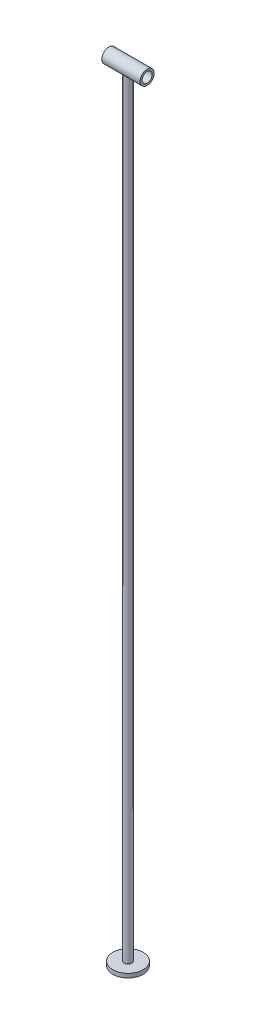
ISO-10303-21;
HEADER;
FILE_DESCRIPTION(('STEP AP214'),'2;1');
FILE_NAME('part.step','',(''),(''),'','','');
FILE_SCHEMA(('AUTOMOTIVE_DESIGN { 1 0 10303 214 1 1 1 1 }'));
ENDSEC;
DATA;
#1=APPLICATION_CONTEXT('core data for automotive mechanical design processes');
#2=APPLICATION_PROTOCOL_DEFINITION('international standard','automotive_design',2000,#1);
#3=PRODUCT_CONTEXT('',#1,'mechanical');
#4=PRODUCT('Part','Part','',(#3));
#5=PRODUCT_RELATED_PRODUCT_CATEGORY('part','',(#4));
#6=PRODUCT_DEFINITION_FORMATION('','',#4);
#7=PRODUCT_DEFINITION_CONTEXT('part definition',#1,'design');
#8=PRODUCT_DEFINITION('design','',#6,#7);
#9=PRODUCT_DEFINITION_SHAPE('','',#8);
#10=(LENGTH_UNIT() NAMED_UNIT(*) SI_UNIT(.MILLI.,.METRE.));
#11=(NAMED_UNIT(*) PLANE_ANGLE_UNIT() SI_UNIT($,.RADIAN.));
#12=(NAMED_UNIT(*) SI_UNIT($,.STERADIAN.) SOLID_ANGLE_UNIT());
#13=UNCERTAINTY_MEASURE_WITH_UNIT(LENGTH_MEASURE(1.E-05),#10,'distance_accuracy_value','');
#14=(GEOMETRIC_REPRESENTATION_CONTEXT(3) GLOBAL_UNCERTAINTY_ASSIGNED_CONTEXT((#13)) GLOBAL_UNIT_ASSIGNED_CONTEXT((#10,
#11,#12)) REPRESENTATION_CONTEXT('',''));
#15=CARTESIAN_POINT('',(0.,0.,0.));
#16=DIRECTION('',(0.,0.,1.));
#17=DIRECTION('',(1.,0.,0.));
#18=AXIS2_PLACEMENT_3D('',#15,#16,#17);
#19=CARTESIAN_POINT('',(-95.,3835.,0.));
#20=DIRECTION('',(1.,0.,0.));
#21=DIRECTION('',(0.,0.,-1.));
#22=AXIS2_PLACEMENT_3D('',#19,#20,#21);
#23=CYLINDRICAL_SURFACE('',#22,34.9999999999998);
#24=CARTESIAN_POINT('',(-95.,3835.,0.));
#25=DIRECTION('',(1.,0.,0.));
#26=DIRECTION('',(0.,0.,-1.));
#27=AXIS2_PLACEMENT_3D('',#24,#25,#26);
#28=CIRCLE('',#27,34.9999999999998);
#29=CARTESIAN_POINT('',(-95.,3835.,-34.9999999999998));
#30=VERTEX_POINT('',#29);
#31=EDGE_CURVE('E11',#30,#30,#28,.T.);
#32=ORIENTED_EDGE('',*,*,#31,.T.);
#33=EDGE_LOOP('',(#32));
#34=FACE_BOUND('',#33,.T.);
#35=CARTESIAN_POINT('',(95.,3835.,0.));
#36=DIRECTION('',(1.,0.,0.));
#37=DIRECTION('',(0.,0.,-1.));
#38=AXIS2_PLACEMENT_3D('',#35,#36,#37);
#39=CIRCLE('',#38,34.9999999999998);
#40=CARTESIAN_POINT('',(95.,3835.,-34.9999999999998));
#41=VERTEX_POINT('',#40);
#42=EDGE_CURVE('E54',#41,#41,#39,.T.);
#43=ORIENTED_EDGE('',*,*,#42,.F.);
#44=EDGE_LOOP('',(#43));
#45=FACE_BOUND('',#44,.T.);
#46=ADVANCED_FACE('F44',(#34,#45),#23,.T.);
#47=CARTESIAN_POINT('',(-95.,3835.,0.));
#48=DIRECTION('',(1.,0.,0.));
#49=DIRECTION('',(0.,0.,-1.));
#50=AXIS2_PLACEMENT_3D('',#47,#48,#49);
#51=PLANE('',#50);
#52=CARTESIAN_POINT('',(-95.,3835.,0.));
#53=DIRECTION('',(1.,0.,0.));
#54=DIRECTION('',(0.,0.,-1.));
#55=AXIS2_PLACEMENT_3D('',#52,#53,#54);
#56=CIRCLE('',#55,25.0000000000003);
#57=CARTESIAN_POINT('',(-95.,3835.,-25.0000000000003));
#58=VERTEX_POINT('',#57);
#59=EDGE_CURVE('E50',#58,#58,#56,.T.);
#60=ORIENTED_EDGE('',*,*,#59,.T.);
#61=EDGE_LOOP('',(#60));
#62=FACE_BOUND('',#61,.T.);
#63=ORIENTED_EDGE('',*,*,#31,.F.);
#64=EDGE_LOOP('',(#63));
#65=FACE_BOUND('',#64,.T.);
#66=ADVANCED_FACE('F73',(#62,#65),#51,.F.);
#67=CARTESIAN_POINT('',(-95.,3835.,0.));
#68=DIRECTION('',(1.,0.,0.));
#69=DIRECTION('',(0.,0.,-1.));
#70=AXIS2_PLACEMENT_3D('',#67,#68,#69);
#71=CYLINDRICAL_SURFACE('',#70,25.0000000000003);
#72=ORIENTED_EDGE('',*,*,#59,.F.);
#73=EDGE_LOOP('',(#72));
#74=FACE_BOUND('',#73,.T.);
#75=CARTESIAN_POINT('',(95.,3835.,0.));
#76=DIRECTION('',(1.,0.,0.));
#77=DIRECTION('',(0.,0.,-1.));
#78=AXIS2_PLACEMENT_3D('',#75,#76,#77);
#79=CIRCLE('',#78,25.0000000000003);
#80=CARTESIAN_POINT('',(95.,3835.,-25.0000000000003));
#81=VERTEX_POINT('',#80);
#82=EDGE_CURVE('E58',#81,#81,#79,.T.);
#83=ORIENTED_EDGE('',*,*,#82,.T.);
#84=EDGE_LOOP('',(#83));
#85=FACE_BOUND('',#84,.T.);
#86=ADVANCED_FACE('F64',(#74,#85),#71,.F.);
#87=CARTESIAN_POINT('',(95.,3835.,0.));
#88=DIRECTION('',(1.,0.,0.));
#89=DIRECTION('',(0.,0.,-1.));
#90=AXIS2_PLACEMENT_3D('',#87,#88,#89);
#91=PLANE('',#90);
#92=ORIENTED_EDGE('',*,*,#42,.T.);
#93=EDGE_LOOP('',(#92));
#94=FACE_BOUND('',#93,.T.);
#95=ORIENTED_EDGE('',*,*,#82,.F.);
#96=EDGE_LOOP('',(#95));
#97=FACE_BOUND('',#96,.T.);
#98=ADVANCED_FACE('F66',(#94,#97),#91,.T.);
#99=CLOSED_SHELL('',(#46,#66,#86,#98));
#100=MANIFOLD_SOLID_BREP('B2',#99);
#101=CARTESIAN_POINT('',(0.,-20.,0.));
#102=DIRECTION('',(0.,1.,0.));
#103=DIRECTION('',(0.,0.,1.));
#104=AXIS2_PLACEMENT_3D('',#101,#102,#103);
#105=CYLINDRICAL_SURFACE('',#104,75.);
#106=CARTESIAN_POINT('',(0.,-20.,0.));
#107=DIRECTION('',(0.,1.,0.));
#108=DIRECTION('',(0.,0.,1.));
#109=AXIS2_PLACEMENT_3D('',#106,#107,#108);
#110=CIRCLE('',#109,75.);
#111=CARTESIAN_POINT('',(0.,-20.,75.));
#112=VERTEX_POINT('',#111);
#113=EDGE_CURVE('E118',#112,#112,#110,.T.);
#114=ORIENTED_EDGE('',*,*,#113,.T.);
#115=EDGE_LOOP('',(#114));
#116=FACE_BOUND('',#115,.T.);
#117=CARTESIAN_POINT('',(0.,0.,0.));
#118=DIRECTION('',(0.,1.,0.));
#119=DIRECTION('',(0.,0.,1.));
#120=AXIS2_PLACEMENT_3D('',#117,#118,#119);
#121=CIRCLE('',#120,75.);
#122=CARTESIAN_POINT('',(0.,0.,75.));
#123=VERTEX_POINT('',#122);
#124=EDGE_CURVE('E114',#123,#123,#121,.T.);
#125=ORIENTED_EDGE('',*,*,#124,.F.);
#126=EDGE_LOOP('',(#125));
#127=FACE_BOUND('',#126,.T.);
#128=ADVANCED_FACE('F111',(#116,#127),#105,.T.);
#129=CARTESIAN_POINT('',(0.,-20.,0.));
#130=DIRECTION('',(0.,1.,0.));
#131=DIRECTION('',(0.,0.,1.));
#132=AXIS2_PLACEMENT_3D('',#129,#130,#131);
#133=PLANE('',#132);
#134=ORIENTED_EDGE('',*,*,#113,.F.);
#135=EDGE_LOOP('',(#134));
#136=FACE_BOUND('',#135,.T.);
#137=ADVANCED_FACE('F145',(#136),#133,.F.);
#138=CARTESIAN_POINT('',(0.,0.,0.));
#139=DIRECTION('',(0.,1.,0.));
#140=DIRECTION('',(0.,0.,1.));
#141=AXIS2_PLACEMENT_3D('',#138,#139,#140);
#142=PLANE('',#141);
#143=CARTESIAN_POINT('',(0.,0.,0.));
#144=DIRECTION('',(0.,1.,0.));
#145=DIRECTION('',(0.,0.,1.));
#146=AXIS2_PLACEMENT_3D('',#143,#144,#145);
#147=CIRCLE('',#146,18.75);
#148=CARTESIAN_POINT('',(0.,0.,18.75));
#149=VERTEX_POINT('',#148);
#150=EDGE_CURVE('E43',#149,#149,#147,.T.);
#151=ORIENTED_EDGE('',*,*,#150,.F.);
#152=EDGE_LOOP('',(#151));
#153=FACE_BOUND('',#152,.T.);
#154=ORIENTED_EDGE('',*,*,#124,.T.);
#155=EDGE_LOOP('',(#154));
#156=FACE_BOUND('',#155,.T.);
#157=ADVANCED_FACE('F141',(#153,#156),#142,.T.);
#158=CARTESIAN_POINT('',(0.,3870.001,0.));
#159=DIRECTION('',(0.,-1.,0.));
#160=DIRECTION('',(0.,0.,-1.));
#161=AXIS2_PLACEMENT_3D('',#158,#159,#160);
#162=CYLINDRICAL_SURFACE('',#161,18.75);
#163=CARTESIAN_POINT('',(0.,3805.44602395616,-18.75));
#164=CARTESIAN_POINT('',(0.483078489030132,3805.44602689294,-18.7500023519711));
#165=CARTESIAN_POINT('',(0.966130378368532,3805.43414067437,-18.7313080619849));
#166=CARTESIAN_POINT('',(1.92839661271527,3805.38707692288,-18.6568145642689));
#167=CARTESIAN_POINT('',(2.40760947441811,3805.35189078889,-18.6010016542922));
#168=CARTESIAN_POINT('',(3.3589599257133,3805.25953015883,-18.4529681470082));
#169=CARTESIAN_POINT('',(3.83108537865545,3805.20232161762,-18.360691172865));
#170=CARTESIAN_POINT('',(4.76412625063492,3805.06805706291,-18.140984638598));
#171=CARTESIAN_POINT('',(5.2250424032562,3804.99100235206,-18.01355738563));
#172=CARTESIAN_POINT('',(6.13015133526577,3804.82020783964,-17.7259107545507));
#173=CARTESIAN_POINT('',(6.57442800829106,3804.72657115302,-17.5658931657045));
#174=CARTESIAN_POINT('',(7.44690963174184,3804.52519505193,-17.2141598932689));
#175=CARTESIAN_POINT('',(7.87511437470673,3804.41745545549,-17.0224438006797));
#176=CARTESIAN_POINT('',(8.71356132769629,3804.19089884604,-16.6088784813843));
#177=CARTESIAN_POINT('',(9.12380579074418,3804.07208322834,-16.3870330486517));
#178=CARTESIAN_POINT('',(9.92500250920011,3803.82632985467,-15.9145598284534));
#179=CARTESIAN_POINT('',(10.3159475838781,3803.69938911532,-15.6639214416751));
#180=CARTESIAN_POINT('',(11.1133645113204,3803.42800756378,-15.1100372625727));
#181=CARTESIAN_POINT('',(11.5177620195399,3803.2830522735,-14.8040540231757));
#182=CARTESIAN_POINT('',(12.2999703150197,3802.99070216343,-14.1608493331689));
#183=CARTESIAN_POINT('',(12.6777795622021,3802.84330720293,-13.8236260756529));
#184=CARTESIAN_POINT('',(13.4053942311087,3802.54955731597,-13.1192402338225));
#185=CARTESIAN_POINT('',(13.7551794991972,3802.40320320575,-12.7520564795259));
#186=CARTESIAN_POINT('',(14.4245559674523,3802.11513912616,-11.9896594887362));
#187=CARTESIAN_POINT('',(14.7441570986943,3801.97342763937,-11.5944555467938));
#188=CARTESIAN_POINT('',(15.375890673634,3801.68678943845,-10.7446222861982));
#189=CARTESIAN_POINT('',(15.6853439342751,3801.54252450623,-10.2877707392461));
#190=CARTESIAN_POINT('',(16.2643279924405,3801.26721179267,-9.34558006425958));
#191=CARTESIAN_POINT('',(16.5338560725982,3801.13616491118,-8.86023900032284));
#192=CARTESIAN_POINT('',(17.0300968574487,3800.89112779912,-7.8643256868616));
#193=CARTESIAN_POINT('',(17.2568332226698,3800.77712815003,-7.35376757863593));
#194=CARTESIAN_POINT('',(17.6649211848263,3800.56954759756,-6.31082422388648));
#195=CARTESIAN_POINT('',(17.8462784530048,3800.47596414286,-5.77844171455093));
#196=CARTESIAN_POINT('',(18.1485581270734,3800.31870267576,-4.7393408735024));
#197=CARTESIAN_POINT('',(18.2731448334945,3800.25323582142,-4.23395817201523));
#198=CARTESIAN_POINT('',(18.4801284375682,3800.14394026934,-3.21230960916974));
#199=CARTESIAN_POINT('',(18.5625273882826,3800.10011051864,-2.69604427868649));
#200=CARTESIAN_POINT('',(18.6839254766529,3800.03539026178,-1.65731639140588));
#201=CARTESIAN_POINT('',(18.7229505232071,3800.01448606142,-1.13485772285126));
#202=CARTESIAN_POINT('',(18.7571021230209,3799.99619799417,-0.0881114690840102));
#203=CARTESIAN_POINT('',(18.7522319084447,3799.99881239554,0.436175978627414));
#204=CARTESIAN_POINT('',(18.701355087278,3800.02604085551,1.4297078111854));
#205=CARTESIAN_POINT('',(18.6594948139769,3800.0484373662,1.89923248959162));
#206=CARTESIAN_POINT('',(18.5407780921292,3800.11167213925,2.83254262302262));
#207=CARTESIAN_POINT('',(18.4639244859928,3800.15250890375,3.29632854104852));
#208=CARTESIAN_POINT('',(18.2761011029837,3800.2516616212,4.21503083967968));
#209=CARTESIAN_POINT('',(18.1651301606746,3800.30997817124,4.66994691672966));
#210=CARTESIAN_POINT('',(17.9102582252019,3800.44275728211,5.56803886221508));
#211=CARTESIAN_POINT('',(17.7663559771398,3800.51722045822,6.01121428253634));
#212=CARTESIAN_POINT('',(17.4451484232257,3800.6816164728,6.88839764757803));
#213=CARTESIAN_POINT('',(17.2674706538733,3800.77172072844,7.32223678959244));
#214=CARTESIAN_POINT('',(16.8814234705126,3800.96484125443,8.17302152001501));
#215=CARTESIAN_POINT('',(16.6730541683526,3801.06785747773,8.58996716998063));
#216=CARTESIAN_POINT('',(16.227189709388,3801.28470319711,9.40514196598119));
#217=CARTESIAN_POINT('',(15.9896884389745,3801.3985349618,9.80336715901978));
#218=CARTESIAN_POINT('',(15.4871661830084,3801.6347391447,10.5794104513586));
#219=CARTESIAN_POINT('',(15.2221427101385,3801.75711233452,10.9572267015032));
#220=CARTESIAN_POINT('',(14.6371002430903,3802.02111089772,11.7292870892041));
#221=CARTESIAN_POINT('',(14.3142282448344,3802.16341367035,12.1211408773303));
#222=CARTESIAN_POINT('',(13.6386731732035,3802.45222506731,12.8765650638491));
#223=CARTESIAN_POINT('',(13.2859882881112,3802.59873394688,13.2401337407847));
#224=CARTESIAN_POINT('',(12.5521769347587,3802.89265591437,13.9377840973876));
#225=CARTESIAN_POINT('',(12.1710250942285,3803.04006969879,14.2718388786618));
#226=CARTESIAN_POINT('',(11.5795684796887,3803.2590110247,14.7492476223629));
#227=CARTESIAN_POINT('',(11.3791201027238,3803.33163097257,14.9044437723076));
#228=CARTESIAN_POINT('',(10.9717597392145,3803.47571257352,15.2068194077808));
#229=CARTESIAN_POINT('',(10.7648457367674,3803.54717385456,15.3539963529742));
#230=CARTESIAN_POINT('',(10.100974937769,3803.77045404024,15.8061459741769));
#231=CARTESIAN_POINT('',(9.63254366689708,3803.91927314742,16.0959992866576));
#232=CARTESIAN_POINT('',(8.66910400833226,3804.20423448556,16.6347155293389));
#233=CARTESIAN_POINT('',(8.17409810818971,3804.3403778998,16.8835822872955));
#234=CARTESIAN_POINT('',(7.1605310071659,3804.59489537729,17.3377436694685));
#235=CARTESIAN_POINT('',(6.64198972342259,3804.71328411346,17.5430743317774));
#236=CARTESIAN_POINT('',(5.58447540517941,3804.92748751585,17.9077867367246));
#237=CARTESIAN_POINT('',(5.04550555565881,3805.02330568434,18.0671756089902));
#238=CARTESIAN_POINT('',(3.99585957514119,3805.18125667848,18.3265848484007));
#239=CARTESIAN_POINT('',(3.48643093522884,3805.24549030752,18.4303700754977));
#240=CARTESIAN_POINT('',(2.4581621359238,3805.34838049004,18.5954562249319));
#241=CARTESIAN_POINT('',(1.93932256091011,3805.3870386261,18.6567597759954));
#242=CARTESIAN_POINT('',(0.897455920693315,3805.43697543419,18.7357887869277));
#243=CARTESIAN_POINT('',(0.374432783303171,3805.44827731625,18.7535511888604));
#244=CARTESIAN_POINT('',(-0.671099858890876,3805.44302610193,18.7452753082323));
#245=CARTESIAN_POINT('',(-1.19360940774302,3805.42647564988,18.7192411837677));
#246=CARTESIAN_POINT('',(-2.16301063317261,3805.37038168361,18.6302969362427));
#247=CARTESIAN_POINT('',(-2.61061315336193,3805.3342332764,18.5728226163617));
#248=CARTESIAN_POINT('',(-3.49857710820353,3805.24294109532,18.4262016188236));
#249=CARTESIAN_POINT('',(-3.93893933034787,3805.18779940176,18.3370584098015));
#250=CARTESIAN_POINT('',(-4.80989123359966,3805.06027982435,18.1281025497623));
#251=CARTESIAN_POINT('',(-5.24047779600365,3804.98789652228,18.0082802568962));
#252=CARTESIAN_POINT('',(-6.08947800150482,3804.82806989427,17.7391965999495));
#253=CARTESIAN_POINT('',(-6.50789082819579,3804.74062556101,17.5899332666649));
#254=CARTESIAN_POINT('',(-7.34862298532102,3804.54897446051,17.2561196002844));
#255=CARTESIAN_POINT('',(-7.77031315842595,3804.44420193411,17.0703117052198));
#256=CARTESIAN_POINT('',(-8.59674288090859,3804.22366518817,16.6694197203043));
#257=CARTESIAN_POINT('',(-9.00147520920003,3804.10789635332,16.4543233210581));
#258=CARTESIAN_POINT('',(-9.79241045078275,3803.86823615765,15.9962523566418));
#259=CARTESIAN_POINT('',(-10.178610035991,3803.74434334731,15.7532728106287));
#260=CARTESIAN_POINT('',(-10.9311346140411,3803.49124540565,15.240737591636));
#261=CARTESIAN_POINT('',(-11.297457932027,3803.36203982825,14.9711796844294));
#262=CARTESIAN_POINT('',(-12.0620046694849,3803.08159102944,14.3646358419998));
#263=CARTESIAN_POINT('',(-12.4568595009169,3802.92993034027,14.0235857465588));
#264=CARTESIAN_POINT('',(-13.216928777301,3802.62712276442,13.3096649831027));
#265=CARTESIAN_POINT('',(-13.5821406509723,3802.47597592341,12.9367915604207));
#266=CARTESIAN_POINT('',(-14.281176352211,3802.17791145774,12.1607295446961));
#267=CARTESIAN_POINT('',(-14.6149841483418,3802.03099601944,11.7575256552558));
#268=CARTESIAN_POINT('',(-15.2489257990027,3801.74511767551,10.9227936250594));
#269=CARTESIAN_POINT('',(-15.5490596403954,3801.60615477299,10.4912654732534));
#270=CARTESIAN_POINT('',(-16.1255579355401,3801.33393706431,9.58282502395325));
#271=CARTESIAN_POINT('',(-16.400347376811,3801.20118392979,9.10475944136573));
#272=CARTESIAN_POINT('',(-16.9082016356358,3800.9518600787,8.1228510337658));
#273=CARTESIAN_POINT('',(-17.141264468115,3800.83529013208,7.61900698385061));
#274=CARTESIAN_POINT('',(-17.5627808369343,3800.62187099665,6.58941445263533));
#275=CARTESIAN_POINT('',(-17.751270314408,3800.52500592795,6.0636840242155));
#276=CARTESIAN_POINT('',(-18.0813244007813,3800.35390579911,4.99412570514865));
#277=CARTESIAN_POINT('',(-18.2228955737902,3800.27966757349,4.45030035779757));
#278=CARTESIAN_POINT('',(-18.4453596435495,3800.16236499336,3.4041360270919));
#279=CARTESIAN_POINT('',(-18.5308834614943,3800.116936327,2.90304295845083));
#280=CARTESIAN_POINT('',(-18.661016844893,3800.04763249081,1.89409698203277));
#281=CARTESIAN_POINT('',(-18.7056291766807,3800.02375586369,1.38624453366455));
#282=CARTESIAN_POINT('',(-18.7533055545966,3799.99823479607,0.368237963103056));
#283=CARTESIAN_POINT('',(-18.756385959755,3799.99658160195,-0.14191517365857));
#284=CARTESIAN_POINT('',(-18.7209952841837,3800.01553298275,-1.16035019841568));
#285=CARTESIAN_POINT('',(-18.6825259741523,3800.03613660916,-1.66863216522743));
#286=CARTESIAN_POINT('',(-18.5694562740761,3800.09641634205,-2.63735939899337));
#287=CARTESIAN_POINT('',(-18.4980950650029,3800.13438056849,-3.09829463525064));
#288=CARTESIAN_POINT('',(-18.3216807984239,3800.22765640391,-4.01184638793907));
#289=CARTESIAN_POINT('',(-18.2166300905405,3800.28296680311,-4.46446348217938));
#290=CARTESIAN_POINT('',(-17.9739473595039,3800.40968945771,-5.35857595898121));
#291=CARTESIAN_POINT('',(-17.8363132925241,3800.48110272317,-5.80007064195463));
#292=CARTESIAN_POINT('',(-17.5298033612852,3800.63847765578,-6.66940379892549));
#293=CARTESIAN_POINT('',(-17.3609260069992,3800.72444001679,-7.09724162047062));
#294=CARTESIAN_POINT('',(-16.9865644203712,3800.91255782879,-7.95268171032961));
#295=CARTESIAN_POINT('',(-16.7799524995045,3801.01519654641,-8.37968367443411));
#296=CARTESIAN_POINT('',(-16.3364012452596,3801.2319962398,-9.21455159319341));
#297=CARTESIAN_POINT('',(-16.0994614947839,3801.34615737402,-9.6224172845623));
#298=CARTESIAN_POINT('',(-15.5968523289541,3801.58368301505,-10.417385359472));
#299=CARTESIAN_POINT('',(-15.3311744177816,3801.70705024008,-10.8044815520827));
#300=CARTESIAN_POINT('',(-14.7727259150392,3801.96049303435,-11.5563141573653));
#301=CARTESIAN_POINT('',(-14.4799525484529,3802.0905692901,-11.9210482734223));
#302=CARTESIAN_POINT('',(-13.8348603014778,3802.36953685763,-12.6660227042854));
#303=CARTESIAN_POINT('',(-13.4795394645716,3802.51891335439,-13.0434863076978));
#304=CARTESIAN_POINT('',(-12.7391979723504,3802.81910250665,-13.7674780020718));
#305=CARTESIAN_POINT('',(-12.3541750775749,3802.96991526969,-14.1140037561395));
#306=CARTESIAN_POINT('',(-11.5557722303047,3803.26931638386,-14.7748248813266));
#307=CARTESIAN_POINT('',(-11.142360653362,3803.41790202206,-15.0890833024213));
#308=CARTESIAN_POINT('',(-10.2893782986565,3803.70865816025,-15.683153624604));
#309=CARTESIAN_POINT('',(-9.84980897600793,3803.8508290163,-15.962967439139));
#310=CARTESIAN_POINT('',(-8.92112358679688,3804.13225927008,-16.5009038052272));
#311=CARTESIAN_POINT('',(-8.43061144918919,3804.27091260372,-16.7569421077794));
#312=CARTESIAN_POINT('',(-7.42503996198074,3804.53144298316,-17.2261171765323));
#313=CARTESIAN_POINT('',(-6.90997644663173,3804.65331716821,-17.4392466299094));
#314=CARTESIAN_POINT('',(-5.86016563152998,3804.87498262533,-17.8194186046201));
#315=CARTESIAN_POINT('',(-5.32547839026498,3804.974835632,-17.9865902982773));
#316=CARTESIAN_POINT('',(-4.23955812893303,3805.14829134379,-18.273030172552));
#317=CARTESIAN_POINT('',(-3.68833626338452,3805.22191133272,-18.3923299005229));
#318=CARTESIAN_POINT('',(-2.61616944155576,3805.3348799016,-18.5739385614649));
#319=CARTESIAN_POINT('',(-2.09606308036741,3805.37638858999,-18.6398572487588));
#320=CARTESIAN_POINT('',(-1.05062743841465,3805.43195945442,-18.7278873817805));
#321=CARTESIAN_POINT('',(-0.525297993047232,3805.44602076271,-18.7499974424742));
#322=CARTESIAN_POINT('',(0.,3805.44602395616,-18.75));
#323=B_SPLINE_CURVE_WITH_KNOTS('',3,(#163,#164,#165,#166,#167,#168,#169,#170,#171,#172,#173,
#174,#175,#176,#177,#178,#179,#180,#181,#182,#183,#184,#185,#186,#187,#188,#189,#190,#191,#192,
#193,#194,#195,#196,#197,#198,#199,#200,#201,#202,#203,#204,#205,#206,#207,#208,#209,#210,#211,
#212,#213,#214,#215,#216,#217,#218,#219,#220,#221,#222,#223,#224,#225,#226,#227,#228,#229,#230,
#231,#232,#233,#234,#235,#236,#237,#238,#239,#240,#241,#242,#243,#244,#245,#246,#247,#248,#249,
#250,#251,#252,#253,#254,#255,#256,#257,#258,#259,#260,#261,#262,#263,#264,#265,#266,#267,#268,
#269,#270,#271,#272,#273,#274,#275,#276,#277,#278,#279,#280,#281,#282,#283,#284,#285,#286,#287,
#288,#289,#290,#291,#292,#293,#294,#295,#296,#297,#298,#299,#300,#301,#302,#303,#304,#305,#306,
#307,#308,#309,#310,#311,#312,#313,#314,#315,#316,#317,#318,#319,#320,#321,#322),.UNSPECIFIED.,
.T.,.F.,(4,2,2,2,2,2,2,2,2,2,2,2,2,2,2,2,2,2,2,2,2,2,2,2,2,2,2,2,2,2,2,2,2,2,2,2,2,2,2,2,2,2,2,
2,2,2,2,2,2,2,2,2,2,2,2,2,2,2,2,2,2,2,2,2,2,2,2,2,2,2,2,2,2,2,2,2,2,2,2,4),(0.,1.44868795256949,
2.89791098177753,4.34938346677183,5.800760704253,7.2434106862925,8.68607928402863,
10.1285663849092,11.5715862086114,13.1522101414948,14.7329255539861,16.3147677308897,
17.8960876293366,19.6048877203424,21.3138040614146,23.0217727169596,24.7295278127486,
26.301194343363,27.872784381751,29.4434351436822,31.0139702539555,32.428048910013,
33.8420127249126,35.2560248456918,36.670090858572,38.1007648500229,39.5314336278347,
40.9624031598561,42.3935021283837,43.973720288047,45.5540345460743,47.1357745265093,
47.9267049146825,48.7178844153626,50.4273536162394,52.1366630782447,53.8445520443996,
55.552175823323,57.1213923941525,58.6905118546547,60.2582995495347,61.8259384051238,
63.1825505885729,64.5390142305742,65.8959047075515,67.2528859727919,68.6692019048665,
70.0861149352221,71.5032814677934,72.9205672317752,74.5488259114554,76.1772256784702,
77.8064522655008,79.4356794881421,81.1348971318694,82.8341955916097,84.5321191364805,
86.2298050328338,87.7588309605167,89.2877534916108,90.8160737770877,92.3443289336601,
93.7466277051399,95.1488286967031,96.5511176661543,97.9534735295621,99.4079743963247,
100.862495268936,102.31744732063,103.772548548386,105.389255122384,107.006083711359,
108.624743587766,110.243313504686,111.952280258524,113.661538020234,115.365941320275,
117.069219576348,118.64446838839,120.219767002005),.UNSPECIFIED.);
#324=CARTESIAN_POINT('',(0.,3805.44602395616,-18.75));
#325=VERTEX_POINT('',#324);
#326=EDGE_CURVE('E124',#325,#325,#323,.T.);
#327=ORIENTED_EDGE('',*,*,#326,.T.);
#328=EDGE_LOOP('',(#327));
#329=FACE_BOUND('',#328,.T.);
#330=ORIENTED_EDGE('',*,*,#150,.T.);
#331=EDGE_LOOP('',(#330));
#332=FACE_BOUND('',#331,.T.);
#333=ADVANCED_FACE('F131',(#329,#332),#162,.T.);
#334=CARTESIAN_POINT('',(-95.,3835.,0.));
#335=DIRECTION('',(1.,0.,0.));
#336=DIRECTION('',(0.,0.,-1.));
#337=AXIS2_PLACEMENT_3D('',#334,#335,#336);
#338=CYLINDRICAL_SURFACE('',#337,34.9999999999998);
#339=ORIENTED_EDGE('',*,*,#326,.F.);
#340=EDGE_LOOP('',(#339));
#341=FACE_BOUND('',#340,.T.);
#342=ADVANCED_FACE('F134',(#341),#338,.F.);
#343=CLOSED_SHELL('',(#128,#137,#157,#333,#342));
#344=MANIFOLD_SOLID_BREP('B6',#343);
#345=ADVANCED_BREP_SHAPE_REPRESENTATION('',(#18,#100,#344),#14);
#346=SHAPE_DEFINITION_REPRESENTATION(#9,#345);
ENDSEC;
END-ISO-10303-21;
